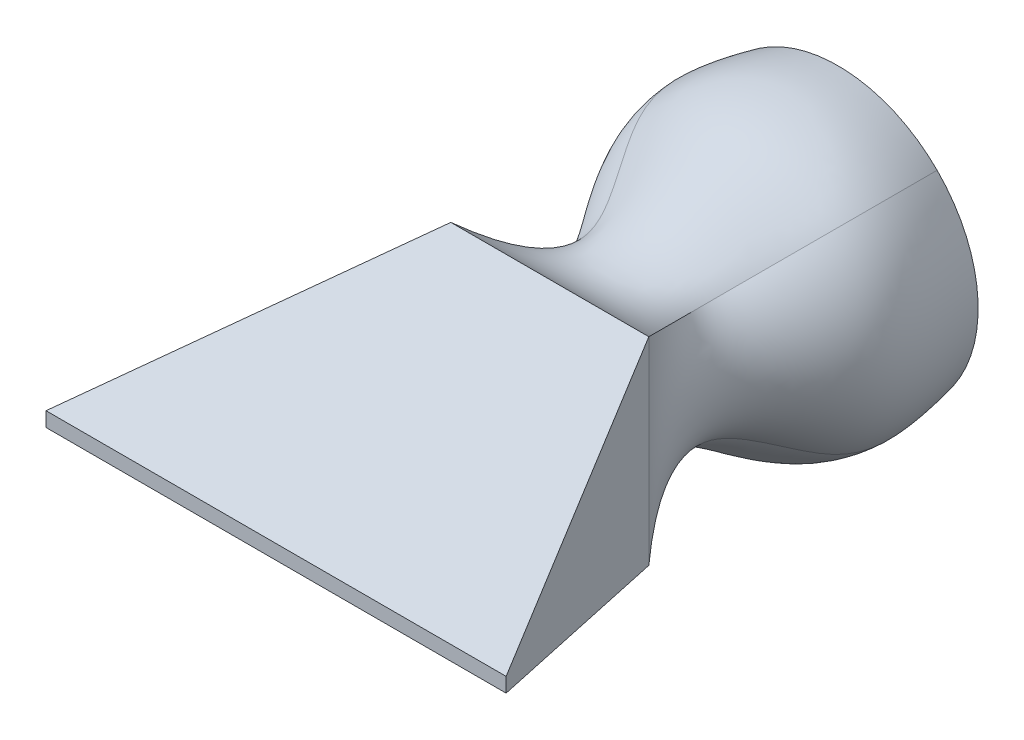
ISO-10303-21;
HEADER;
FILE_DESCRIPTION(('STEP AP214'),'2;1');
FILE_NAME('part.step','',(''),(''),'','','');
FILE_SCHEMA(('AUTOMOTIVE_DESIGN { 1 0 10303 214 1 1 1 1 }'));
ENDSEC;
DATA;
#1=APPLICATION_CONTEXT('core data for automotive mechanical design processes');
#2=APPLICATION_PROTOCOL_DEFINITION('international standard','automotive_design',2000,#1);
#3=PRODUCT_CONTEXT('',#1,'mechanical');
#4=PRODUCT('Part','Part','',(#3));
#5=PRODUCT_RELATED_PRODUCT_CATEGORY('part','',(#4));
#6=PRODUCT_DEFINITION_FORMATION('','',#4);
#7=PRODUCT_DEFINITION_CONTEXT('part definition',#1,'design');
#8=PRODUCT_DEFINITION('design','',#6,#7);
#9=PRODUCT_DEFINITION_SHAPE('','',#8);
#10=(LENGTH_UNIT() NAMED_UNIT(*) SI_UNIT(.MILLI.,.METRE.));
#11=(NAMED_UNIT(*) PLANE_ANGLE_UNIT() SI_UNIT($,.RADIAN.));
#12=(NAMED_UNIT(*) SI_UNIT($,.STERADIAN.) SOLID_ANGLE_UNIT());
#13=UNCERTAINTY_MEASURE_WITH_UNIT(LENGTH_MEASURE(1.E-05),#10,'distance_accuracy_value','');
#14=(GEOMETRIC_REPRESENTATION_CONTEXT(3) GLOBAL_UNCERTAINTY_ASSIGNED_CONTEXT((#13)) GLOBAL_UNIT_ASSIGNED_CONTEXT((#10,
#11,#12)) REPRESENTATION_CONTEXT('',''));
#15=CARTESIAN_POINT('',(0.,0.,0.));
#16=DIRECTION('',(0.,0.,1.));
#17=DIRECTION('',(1.,0.,0.));
#18=AXIS2_PLACEMENT_3D('',#15,#16,#17);
#19=CARTESIAN_POINT('',(0.,0.,0.));
#20=DIRECTION('',(0.,0.,1.));
#21=DIRECTION('',(1.,0.,0.));
#22=AXIS2_PLACEMENT_3D('',#19,#20,#21);
#23=PLANE('',#22);
#24=CARTESIAN_POINT('',(0.,0.,0.));
#25=DIRECTION('',(0.,0.,1.));
#26=DIRECTION('',(1.,0.,0.));
#27=AXIS2_PLACEMENT_3D('',#24,#25,#26);
#28=CIRCLE('',#27,48.0832611206853);
#29=CARTESIAN_POINT('',(-34.,34.,0.));
#30=VERTEX_POINT('',#29);
#31=CARTESIAN_POINT('',(-34.,-34.,0.));
#32=VERTEX_POINT('',#31);
#33=EDGE_CURVE('E12',#30,#32,#28,.T.);
#34=ORIENTED_EDGE('',*,*,#33,.F.);
#35=CARTESIAN_POINT('',(34.,34.,0.));
#36=VERTEX_POINT('',#35);
#37=EDGE_CURVE('E339',#36,#30,#28,.T.);
#38=ORIENTED_EDGE('',*,*,#37,.F.);
#39=CARTESIAN_POINT('',(34.,-34.,0.));
#40=VERTEX_POINT('',#39);
#41=EDGE_CURVE('E340',#40,#36,#28,.T.);
#42=ORIENTED_EDGE('',*,*,#41,.F.);
#43=EDGE_CURVE('E83',#32,#40,#28,.T.);
#44=ORIENTED_EDGE('',*,*,#43,.F.);
#45=EDGE_LOOP('',(#34,#38,#42,#44));
#46=FACE_BOUND('',#45,.T.);
#47=ADVANCED_FACE('F73',(#46),#23,.F.);
#48=CARTESIAN_POINT('',(34.,34.,99.));
#49=CARTESIAN_POINT('',(25.0040644362733,25.0040644362733,88.));
#50=CARTESIAN_POINT('',(13.4214700705891,13.4214700705891,64.3051609146192));
#51=CARTESIAN_POINT('',(38.1308054514588,38.1308054514588,35.7945659439873));
#52=CARTESIAN_POINT('',(36.0754701746698,36.0754701746698,11.8486725434439));
#53=CARTESIAN_POINT('',(34.,34.,0.));
#54=CARTESIAN_POINT('',(34.,11.3333333333333,99.));
#55=CARTESIAN_POINT('',(25.0040644362733,8.33468814542442,88.));
#56=CARTESIAN_POINT('',(27.5730687796223,7.41615934743147,64.3051609146192));
#57=CARTESIAN_POINT('',(58.0567627558353,16.8531828307176,35.7945659439873));
#58=CARTESIAN_POINT('',(54.8405805120552,15.9267130541712,11.8486725434439));
#59=CARTESIAN_POINT('',(52.7651103373854,15.2348896626146,0.));
#60=CARTESIAN_POINT('',(34.,-11.3333333333333,99.));
#61=CARTESIAN_POINT('',(25.0040644362733,-8.33468814542442,88.));
#62=CARTESIAN_POINT('',(27.5730687796223,-7.4161593474315,64.3051609146192));
#63=CARTESIAN_POINT('',(58.0567627558353,-16.8531828307176,35.7945659439873));
#64=CARTESIAN_POINT('',(54.8405805120552,-15.9267130541712,11.8486725434439));
#65=CARTESIAN_POINT('',(52.7651103373854,-15.2348896626146,0.));
#66=CARTESIAN_POINT('',(34.,-34.,99.));
#67=CARTESIAN_POINT('',(25.0040644362733,-25.0040644362733,88.));
#68=CARTESIAN_POINT('',(13.4214700705891,-13.4214700705891,64.3051609146192));
#69=CARTESIAN_POINT('',(38.1308054514588,-38.1308054514588,35.7945659439873));
#70=CARTESIAN_POINT('',(36.0754701746698,-36.0754701746698,11.8486725434439));
#71=CARTESIAN_POINT('',(34.,-34.,0.));
#72=B_SPLINE_SURFACE_WITH_KNOTS('',3,3,((#48,#49,#50,#51,#52,#53),(#54,#55,#56,#57,#58,#59),
(#60,#61,#62,#63,#64,#65),(#66,#67,#68,#69,#70,#71)),.UNSPECIFIED.,.F.,.F.,.F.,(4,4),(4,1,1,4),
(0.,1.),(0.,0.334508099972556,0.691210840117049,1.),.UNSPECIFIED.);
#73=DIRECTION('',(0.,1.,0.));
#74=VECTOR('',#73,1.);
#75=CARTESIAN_POINT('',(34.,34.,99.));
#76=LINE('',#75,#74);
#77=CARTESIAN_POINT('',(34.,-34.,99.));
#78=VERTEX_POINT('',#77);
#79=CARTESIAN_POINT('',(34.,34.,99.));
#80=VERTEX_POINT('',#79);
#81=EDGE_CURVE('E77',#78,#80,#76,.T.);
#82=CARTESIAN_POINT('',(34.,-34.,99.));
#83=CARTESIAN_POINT('',(25.0040644362733,-25.0040644362733,88.));
#84=CARTESIAN_POINT('',(13.4214700705891,-13.4214700705891,64.3051609146192));
#85=CARTESIAN_POINT('',(38.1308054514588,-38.1308054514588,35.7945659439873));
#86=CARTESIAN_POINT('',(36.0754701746698,-36.0754701746698,11.8486725434439));
#87=CARTESIAN_POINT('',(34.,-34.,0.));
#88=B_SPLINE_CURVE_WITH_KNOTS('',3,(#82,#83,#84,#85,#86,#87),.UNSPECIFIED.,.F.,.F.,(4,1,1,4),
(0.,0.334508099972556,0.691210840117049,1.),.UNSPECIFIED.);
#89=EDGE_CURVE('E312',#78,#40,#88,.T.);
#90=CARTESIAN_POINT('',(34.,34.,99.));
#91=CARTESIAN_POINT('',(25.0040644362733,25.0040644362733,88.));
#92=CARTESIAN_POINT('',(13.4214700705891,13.4214700705891,64.3051609146192));
#93=CARTESIAN_POINT('',(38.1308054514588,38.1308054514588,35.7945659439873));
#94=CARTESIAN_POINT('',(36.0754701746698,36.0754701746698,11.8486725434439));
#95=CARTESIAN_POINT('',(34.,34.,0.));
#96=B_SPLINE_CURVE_WITH_KNOTS('',3,(#90,#91,#92,#93,#94,#95),.UNSPECIFIED.,.F.,.F.,(4,1,1,4),
(0.,0.334508099972556,0.691210840117049,1.),.UNSPECIFIED.);
#97=EDGE_CURVE('E311',#36,#80,#96,.F.);
#98=ORIENTED_EDGE('',*,*,#81,.F.);
#99=ORIENTED_EDGE('',*,*,#89,.T.);
#100=ORIENTED_EDGE('',*,*,#41,.T.);
#101=ORIENTED_EDGE('',*,*,#97,.T.);
#102=EDGE_LOOP('',(#98,#99,#100,#101));
#103=FACE_BOUND('',#102,.T.);
#104=ADVANCED_FACE('F187',(#103),#72,.T.);
#105=CARTESIAN_POINT('',(34.,-34.,99.));
#106=CARTESIAN_POINT('',(25.0040644362733,-25.0040644362733,88.));
#107=CARTESIAN_POINT('',(13.4214700705891,-13.4214700705891,64.3051609146192));
#108=CARTESIAN_POINT('',(38.1308054514588,-38.1308054514588,35.7945659439873));
#109=CARTESIAN_POINT('',(36.0754701746698,-36.0754701746698,11.8486725434439));
#110=CARTESIAN_POINT('',(34.,-34.,0.));
#111=CARTESIAN_POINT('',(11.3333333333333,-34.,99.));
#112=CARTESIAN_POINT('',(8.33468814542442,-25.0040644362733,88.));
#113=CARTESIAN_POINT('',(7.41615934743147,-27.5730687796223,64.3051609146192));
#114=CARTESIAN_POINT('',(16.8531828307176,-58.0567627558353,35.7945659439873));
#115=CARTESIAN_POINT('',(15.9267130541712,-54.8405805120552,11.8486725434439));
#116=CARTESIAN_POINT('',(15.2348896626146,-52.7651103373854,0.));
#117=CARTESIAN_POINT('',(-11.3333333333333,-34.,99.));
#118=CARTESIAN_POINT('',(-8.33468814542442,-25.0040644362733,88.));
#119=CARTESIAN_POINT('',(-7.4161593474315,-27.5730687796223,64.3051609146192));
#120=CARTESIAN_POINT('',(-16.8531828307176,-58.0567627558353,35.7945659439873));
#121=CARTESIAN_POINT('',(-15.9267130541712,-54.8405805120552,11.8486725434439));
#122=CARTESIAN_POINT('',(-15.2348896626146,-52.7651103373854,0.));
#123=CARTESIAN_POINT('',(-34.,-34.,99.));
#124=CARTESIAN_POINT('',(-25.0040644362733,-25.0040644362733,88.));
#125=CARTESIAN_POINT('',(-13.4214700705891,-13.4214700705891,64.3051609146192));
#126=CARTESIAN_POINT('',(-38.1308054514588,-38.1308054514588,35.7945659439873));
#127=CARTESIAN_POINT('',(-36.0754701746698,-36.0754701746698,11.8486725434439));
#128=CARTESIAN_POINT('',(-34.,-34.,0.));
#129=B_SPLINE_SURFACE_WITH_KNOTS('',3,3,((#105,#106,#107,#108,#109,#110),(#111,#112,#113,#114,
#115,#116),(#117,#118,#119,#120,#121,#122),(#123,#124,#125,#126,#127,#128)),.UNSPECIFIED.,.F.,
.F.,.F.,(4,4),(4,1,1,4),(0.,1.),(0.,0.334508099972556,0.691210840117049,1.),.UNSPECIFIED.);
#130=DIRECTION('',(1.,0.,0.));
#131=VECTOR('',#130,1.);
#132=CARTESIAN_POINT('',(-34.,-34.,99.));
#133=LINE('',#132,#131);
#134=CARTESIAN_POINT('',(-34.,-34.,99.));
#135=VERTEX_POINT('',#134);
#136=EDGE_CURVE('E314',#135,#78,#133,.T.);
#137=CARTESIAN_POINT('',(-34.,-34.,99.));
#138=CARTESIAN_POINT('',(-25.0040644362733,-25.0040644362733,88.));
#139=CARTESIAN_POINT('',(-13.4214700705891,-13.4214700705891,64.3051609146192));
#140=CARTESIAN_POINT('',(-38.1308054514588,-38.1308054514588,35.7945659439873));
#141=CARTESIAN_POINT('',(-36.0754701746698,-36.0754701746698,11.8486725434439));
#142=CARTESIAN_POINT('',(-34.,-34.,0.));
#143=B_SPLINE_CURVE_WITH_KNOTS('',3,(#137,#138,#139,#140,#141,#142),.UNSPECIFIED.,.F.,.F.,(4,1,
1,4),(0.,0.334508099972556,0.691210840117049,1.),.UNSPECIFIED.);
#144=EDGE_CURVE('E91',#135,#32,#143,.T.);
#145=ORIENTED_EDGE('',*,*,#136,.F.);
#146=ORIENTED_EDGE('',*,*,#144,.T.);
#147=ORIENTED_EDGE('',*,*,#43,.T.);
#148=ORIENTED_EDGE('',*,*,#89,.F.);
#149=EDGE_LOOP('',(#145,#146,#147,#148));
#150=FACE_BOUND('',#149,.T.);
#151=ADVANCED_FACE('F415',(#150),#129,.T.);
#152=CARTESIAN_POINT('',(-34.,34.,99.));
#153=CARTESIAN_POINT('',(-25.0040644362733,25.0040644362733,88.));
#154=CARTESIAN_POINT('',(-13.4214700705891,13.4214700705891,64.3051609146192));
#155=CARTESIAN_POINT('',(-38.1308054514588,38.1308054514588,35.7945659439873));
#156=CARTESIAN_POINT('',(-36.0754701746698,36.0754701746698,11.8486725434439));
#157=CARTESIAN_POINT('',(-34.,34.,0.));
#158=CARTESIAN_POINT('',(-11.3333333333333,34.,99.));
#159=CARTESIAN_POINT('',(-8.33468814542442,25.0040644362733,88.));
#160=CARTESIAN_POINT('',(-7.41615934743148,27.5730687796223,64.3051609146192));
#161=CARTESIAN_POINT('',(-16.8531828307176,58.0567627558353,35.7945659439873));
#162=CARTESIAN_POINT('',(-15.9267130541712,54.8405805120552,11.8486725434439));
#163=CARTESIAN_POINT('',(-15.2348896626146,52.7651103373854,0.));
#164=CARTESIAN_POINT('',(11.3333333333333,34.,99.));
#165=CARTESIAN_POINT('',(8.33468814542442,25.0040644362733,88.));
#166=CARTESIAN_POINT('',(7.41615934743149,27.5730687796223,64.3051609146192));
#167=CARTESIAN_POINT('',(16.8531828307176,58.0567627558353,35.7945659439873));
#168=CARTESIAN_POINT('',(15.9267130541712,54.8405805120552,11.8486725434439));
#169=CARTESIAN_POINT('',(15.2348896626146,52.7651103373854,0.));
#170=CARTESIAN_POINT('',(34.,34.,99.));
#171=CARTESIAN_POINT('',(25.0040644362733,25.0040644362733,88.));
#172=CARTESIAN_POINT('',(13.4214700705891,13.4214700705891,64.3051609146192));
#173=CARTESIAN_POINT('',(38.1308054514588,38.1308054514588,35.7945659439873));
#174=CARTESIAN_POINT('',(36.0754701746698,36.0754701746698,11.8486725434439));
#175=CARTESIAN_POINT('',(34.,34.,0.));
#176=B_SPLINE_SURFACE_WITH_KNOTS('',3,3,((#152,#153,#154,#155,#156,#157),(#158,#159,#160,#161,
#162,#163),(#164,#165,#166,#167,#168,#169),(#170,#171,#172,#173,#174,#175)),.UNSPECIFIED.,.F.,
.F.,.F.,(4,4),(4,1,1,4),(0.,1.),(0.,0.334508099972556,0.691210840117049,1.),.UNSPECIFIED.);
#177=DIRECTION('',(-1.,0.,0.));
#178=VECTOR('',#177,1.);
#179=CARTESIAN_POINT('',(-34.,34.,99.));
#180=LINE('',#179,#178);
#181=CARTESIAN_POINT('',(-34.,34.,99.));
#182=VERTEX_POINT('',#181);
#183=EDGE_CURVE('E307',#80,#182,#180,.T.);
#184=CARTESIAN_POINT('',(-34.,34.,99.));
#185=CARTESIAN_POINT('',(-25.0040644362733,25.0040644362733,88.));
#186=CARTESIAN_POINT('',(-13.4214700705891,13.4214700705891,64.3051609146192));
#187=CARTESIAN_POINT('',(-38.1308054514588,38.1308054514588,35.7945659439873));
#188=CARTESIAN_POINT('',(-36.0754701746698,36.0754701746698,11.8486725434439));
#189=CARTESIAN_POINT('',(-34.,34.,0.));
#190=B_SPLINE_CURVE_WITH_KNOTS('',3,(#184,#185,#186,#187,#188,#189),.UNSPECIFIED.,.F.,.F.,(4,1,
1,4),(0.,0.334508099972556,0.691210840117049,1.),.UNSPECIFIED.);
#191=EDGE_CURVE('E361',#182,#30,#190,.T.);
#192=ORIENTED_EDGE('',*,*,#183,.F.);
#193=ORIENTED_EDGE('',*,*,#97,.F.);
#194=ORIENTED_EDGE('',*,*,#37,.T.);
#195=ORIENTED_EDGE('',*,*,#191,.F.);
#196=EDGE_LOOP('',(#192,#193,#194,#195));
#197=FACE_BOUND('',#196,.T.);
#198=ADVANCED_FACE('F425',(#197),#176,.T.);
#199=CARTESIAN_POINT('',(-34.,-34.,99.));
#200=CARTESIAN_POINT('',(-25.0040644362733,-25.0040644362733,88.));
#201=CARTESIAN_POINT('',(-13.4214700705891,-13.4214700705891,64.3051609146192));
#202=CARTESIAN_POINT('',(-38.1308054514588,-38.1308054514588,35.7945659439873));
#203=CARTESIAN_POINT('',(-36.0754701746698,-36.0754701746698,11.8486725434439));
#204=CARTESIAN_POINT('',(-34.,-34.,0.));
#205=CARTESIAN_POINT('',(-34.,-11.3333333333333,99.));
#206=CARTESIAN_POINT('',(-25.0040644362733,-8.33468814542442,88.));
#207=CARTESIAN_POINT('',(-27.5730687796223,-7.41615934743148,64.3051609146192));
#208=CARTESIAN_POINT('',(-58.0567627558353,-16.8531828307176,35.7945659439873));
#209=CARTESIAN_POINT('',(-54.8405805120552,-15.9267130541712,11.8486725434439));
#210=CARTESIAN_POINT('',(-52.7651103373854,-15.2348896626146,0.));
#211=CARTESIAN_POINT('',(-34.,11.3333333333333,99.));
#212=CARTESIAN_POINT('',(-25.0040644362733,8.33468814542442,88.));
#213=CARTESIAN_POINT('',(-27.5730687796223,7.41615934743149,64.3051609146192));
#214=CARTESIAN_POINT('',(-58.0567627558353,16.8531828307176,35.7945659439873));
#215=CARTESIAN_POINT('',(-54.8405805120552,15.9267130541712,11.8486725434439));
#216=CARTESIAN_POINT('',(-52.7651103373854,15.2348896626146,0.));
#217=CARTESIAN_POINT('',(-34.,34.,99.));
#218=CARTESIAN_POINT('',(-25.0040644362733,25.0040644362733,88.));
#219=CARTESIAN_POINT('',(-13.4214700705891,13.4214700705891,64.3051609146192));
#220=CARTESIAN_POINT('',(-38.1308054514588,38.1308054514588,35.7945659439873));
#221=CARTESIAN_POINT('',(-36.0754701746698,36.0754701746698,11.8486725434439));
#222=CARTESIAN_POINT('',(-34.,34.,0.));
#223=B_SPLINE_SURFACE_WITH_KNOTS('',3,3,((#199,#200,#201,#202,#203,#204),(#205,#206,#207,#208,
#209,#210),(#211,#212,#213,#214,#215,#216),(#217,#218,#219,#220,#221,#222)),.UNSPECIFIED.,.F.,
.F.,.F.,(4,4),(4,1,1,4),(0.,1.),(0.,0.334508099972556,0.691210840117049,1.),.UNSPECIFIED.);
#224=DIRECTION('',(0.,-1.,0.));
#225=VECTOR('',#224,1.);
#226=CARTESIAN_POINT('',(-34.,34.,99.));
#227=LINE('',#226,#225);
#228=EDGE_CURVE('E154',#182,#135,#227,.T.);
#229=ORIENTED_EDGE('',*,*,#228,.F.);
#230=ORIENTED_EDGE('',*,*,#191,.T.);
#231=ORIENTED_EDGE('',*,*,#33,.T.);
#232=ORIENTED_EDGE('',*,*,#144,.F.);
#233=EDGE_LOOP('',(#229,#230,#231,#232));
#234=FACE_BOUND('',#233,.T.);
#235=ADVANCED_FACE('F183',(#234),#223,.T.);
#236=CARTESIAN_POINT('',(0.,0.,193.));
#237=DIRECTION('',(0.,0.,-1.));
#238=DIRECTION('',(-1.,0.,0.));
#239=AXIS2_PLACEMENT_3D('',#236,#237,#238);
#240=PLANE('',#239);
#241=DIRECTION('',(0.,-1.,0.));
#242=VECTOR('',#241,1.);
#243=CARTESIAN_POINT('',(-79.,2.49999999999999,193.));
#244=LINE('',#243,#242);
#245=CARTESIAN_POINT('',(-79.,2.49999999999999,193.));
#246=VERTEX_POINT('',#245);
#247=CARTESIAN_POINT('',(-79.,-2.50000000000001,193.));
#248=VERTEX_POINT('',#247);
#249=EDGE_CURVE('E143',#246,#248,#244,.T.);
#250=ORIENTED_EDGE('',*,*,#249,.T.);
#251=DIRECTION('',(1.,0.,0.));
#252=VECTOR('',#251,1.);
#253=CARTESIAN_POINT('',(79.,-2.49999999999999,193.));
#254=LINE('',#253,#252);
#255=CARTESIAN_POINT('',(79.,-2.49999999999999,193.));
#256=VERTEX_POINT('',#255);
#257=EDGE_CURVE('E130',#248,#256,#254,.T.);
#258=ORIENTED_EDGE('',*,*,#257,.T.);
#259=DIRECTION('',(0.,1.,0.));
#260=VECTOR('',#259,1.);
#261=CARTESIAN_POINT('',(79.,2.50000000000001,193.));
#262=LINE('',#261,#260);
#263=CARTESIAN_POINT('',(79.,2.50000000000001,193.));
#264=VERTEX_POINT('',#263);
#265=EDGE_CURVE('E142',#256,#264,#262,.T.);
#266=ORIENTED_EDGE('',*,*,#265,.T.);
#267=DIRECTION('',(-1.,0.,0.));
#268=VECTOR('',#267,1.);
#269=CARTESIAN_POINT('',(79.,2.50000000000001,193.));
#270=LINE('',#269,#268);
#271=EDGE_CURVE('E161',#264,#246,#270,.T.);
#272=ORIENTED_EDGE('',*,*,#271,.T.);
#273=EDGE_LOOP('',(#250,#258,#266,#272));
#274=FACE_BOUND('',#273,.T.);
#275=ADVANCED_FACE('F159',(#274),#240,.F.);
#276=CARTESIAN_POINT('',(10.8964183776816,0.,5.21637049995395));
#277=DIRECTION('',(0.901971773298313,0.,0.431794997855575));
#278=DIRECTION('',(0.431794997855575,0.,-0.901971773298313));
#279=AXIS2_PLACEMENT_3D('',#276,#277,#278);
#280=PLANE('',#279);
#281=DIRECTION('',(-0.413327014977984,0.289328910484589,0.863394209065123));
#282=VECTOR('',#281,1.);
#283=CARTESIAN_POINT('',(-34.,-34.,99.));
#284=LINE('',#283,#282);
#285=EDGE_CURVE('E135',#135,#248,#284,.T.);
#286=ORIENTED_EDGE('',*,*,#285,.T.);
#287=ORIENTED_EDGE('',*,*,#249,.F.);
#288=DIRECTION('',(-0.413327014977984,-0.289328910484589,0.863394209065123));
#289=VECTOR('',#288,1.);
#290=CARTESIAN_POINT('',(-34.,34.,99.));
#291=LINE('',#290,#289);
#292=EDGE_CURVE('E156',#182,#246,#291,.T.);
#293=ORIENTED_EDGE('',*,*,#292,.F.);
#294=ORIENTED_EDGE('',*,*,#228,.T.);
#295=EDGE_LOOP('',(#286,#287,#293,#294));
#296=FACE_BOUND('',#295,.T.);
#297=ADVANCED_FACE('F150',(#296),#280,.F.);
#298=CARTESIAN_POINT('',(0.,60.3935593823926,20.2382672398443));
#299=DIRECTION('',(0.,-0.948177741610104,-0.317740413411897));
#300=DIRECTION('',(0.,0.317740413411897,-0.948177741610104));
#301=AXIS2_PLACEMENT_3D('',#298,#299,#300);
#302=PLANE('',#301);
#303=ORIENTED_EDGE('',*,*,#292,.T.);
#304=ORIENTED_EDGE('',*,*,#271,.F.);
#305=DIRECTION('',(0.413327014977985,-0.289328910484589,0.863394209065123));
#306=VECTOR('',#305,1.);
#307=CARTESIAN_POINT('',(34.,34.,99.));
#308=LINE('',#307,#306);
#309=EDGE_CURVE('E163',#80,#264,#308,.T.);
#310=ORIENTED_EDGE('',*,*,#309,.F.);
#311=ORIENTED_EDGE('',*,*,#183,.T.);
#312=EDGE_LOOP('',(#303,#304,#310,#311));
#313=FACE_BOUND('',#312,.T.);
#314=ADVANCED_FACE('F235',(#313),#302,.F.);
#315=CARTESIAN_POINT('',(0.,-60.3935593823926,20.2382672398443));
#316=DIRECTION('',(0.,0.948177741610104,-0.317740413411897));
#317=DIRECTION('',(0.,0.317740413411897,0.948177741610104));
#318=AXIS2_PLACEMENT_3D('',#315,#316,#317);
#319=PLANE('',#318);
#320=DIRECTION('',(0.413327014977985,0.289328910484589,0.863394209065123));
#321=VECTOR('',#320,1.);
#322=CARTESIAN_POINT('',(34.,-34.,99.));
#323=LINE('',#322,#321);
#324=EDGE_CURVE('E137',#78,#256,#323,.T.);
#325=ORIENTED_EDGE('',*,*,#324,.T.);
#326=ORIENTED_EDGE('',*,*,#257,.F.);
#327=ORIENTED_EDGE('',*,*,#285,.F.);
#328=ORIENTED_EDGE('',*,*,#136,.T.);
#329=EDGE_LOOP('',(#325,#326,#327,#328));
#330=FACE_BOUND('',#329,.T.);
#331=ADVANCED_FACE('F133',(#330),#319,.F.);
#332=CARTESIAN_POINT('',(-10.8964183776816,0.,5.21637049995398));
#333=DIRECTION('',(-0.901971773298313,0.,0.431794997855576));
#334=DIRECTION('',(0.431794997855576,0.,0.901971773298313));
#335=AXIS2_PLACEMENT_3D('',#332,#333,#334);
#336=PLANE('',#335);
#337=ORIENTED_EDGE('',*,*,#309,.T.);
#338=ORIENTED_EDGE('',*,*,#265,.F.);
#339=ORIENTED_EDGE('',*,*,#324,.F.);
#340=ORIENTED_EDGE('',*,*,#81,.T.);
#341=EDGE_LOOP('',(#337,#338,#339,#340));
#342=FACE_BOUND('',#341,.T.);
#343=ADVANCED_FACE('F184',(#342),#336,.F.);
#344=CLOSED_SHELL('',(#47,#104,#151,#198,#235,#275,#297,#314,#331,#343));
#345=MANIFOLD_SOLID_BREP('B2',#344);
#346=ADVANCED_BREP_SHAPE_REPRESENTATION('',(#18,#345),#14);
#347=SHAPE_DEFINITION_REPRESENTATION(#9,#346);
ENDSEC;
END-ISO-10303-21;
